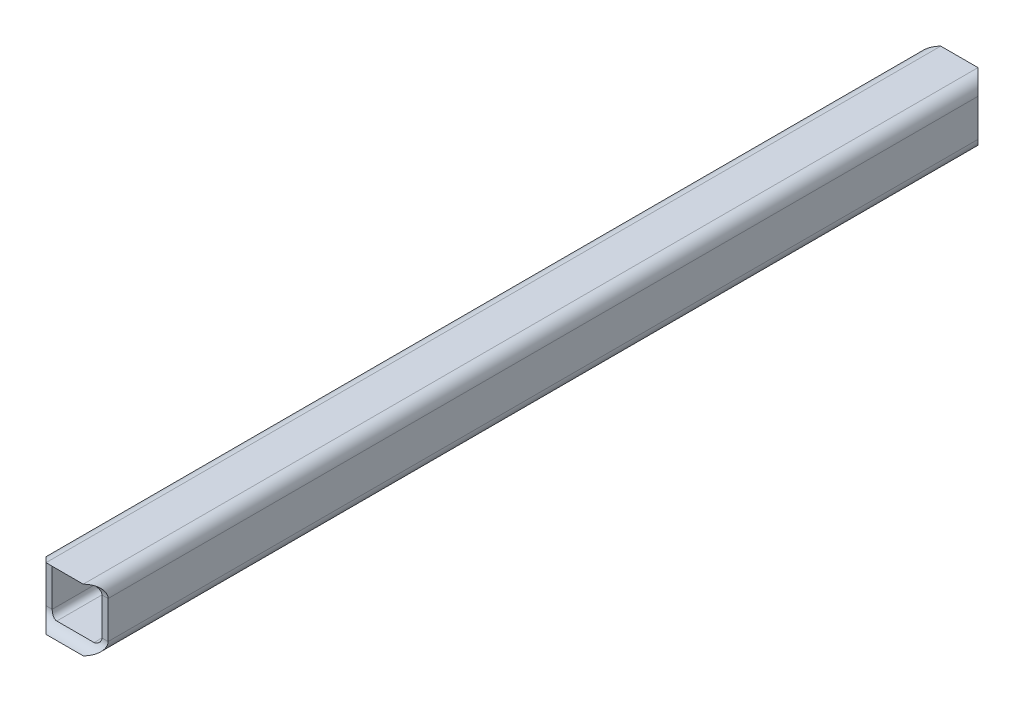
ISO-10303-21;
HEADER;
FILE_DESCRIPTION(('STEP AP214'),'2;1');
FILE_NAME('part.step','',(''),(''),'','','');
FILE_SCHEMA(('AUTOMOTIVE_DESIGN { 1 0 10303 214 1 1 1 1 }'));
ENDSEC;
DATA;
#1=APPLICATION_CONTEXT('core data for automotive mechanical design processes');
#2=APPLICATION_PROTOCOL_DEFINITION('international standard','automotive_design',2000,#1);
#3=PRODUCT_CONTEXT('',#1,'mechanical');
#4=PRODUCT('Part','Part','',(#3));
#5=PRODUCT_RELATED_PRODUCT_CATEGORY('part','',(#4));
#6=PRODUCT_DEFINITION_FORMATION('','',#4);
#7=PRODUCT_DEFINITION_CONTEXT('part definition',#1,'design');
#8=PRODUCT_DEFINITION('design','',#6,#7);
#9=PRODUCT_DEFINITION_SHAPE('','',#8);
#10=(LENGTH_UNIT() NAMED_UNIT(*) SI_UNIT(.MILLI.,.METRE.));
#11=(NAMED_UNIT(*) PLANE_ANGLE_UNIT() SI_UNIT($,.RADIAN.));
#12=(NAMED_UNIT(*) SI_UNIT($,.STERADIAN.) SOLID_ANGLE_UNIT());
#13=UNCERTAINTY_MEASURE_WITH_UNIT(LENGTH_MEASURE(1.E-05),#10,'distance_accuracy_value','');
#14=(GEOMETRIC_REPRESENTATION_CONTEXT(3) GLOBAL_UNCERTAINTY_ASSIGNED_CONTEXT((#13)) GLOBAL_UNIT_ASSIGNED_CONTEXT((#10,
#11,#12)) REPRESENTATION_CONTEXT('',''));
#15=CARTESIAN_POINT('',(0.,0.,0.));
#16=DIRECTION('',(0.,0.,1.));
#17=DIRECTION('',(1.,0.,0.));
#18=AXIS2_PLACEMENT_3D('',#15,#16,#17);
#19=CARTESIAN_POINT('',(-6.00000000000001,226.,-2300.));
#20=DIRECTION('',(0.,0.,1.));
#21=DIRECTION('',(0.,-1.,0.));
#22=AXIS2_PLACEMENT_3D('',#19,#20,#21);
#23=CYLINDRICAL_SURFACE('',#22,2.);
#24=DIRECTION('',(0.,0.,1.));
#25=VECTOR('',#24,1.);
#26=CARTESIAN_POINT('',(-8.00000000000001,226.,-2300.));
#27=LINE('',#26,#25);
#28=CARTESIAN_POINT('',(-8.00000000000001,226.,-2290.));
#29=VERTEX_POINT('',#28);
#30=CARTESIAN_POINT('',(-8.00000000000001,226.,-2010.));
#31=VERTEX_POINT('',#30);
#32=EDGE_CURVE('E180',#29,#31,#27,.T.);
#33=ORIENTED_EDGE('',*,*,#32,.F.);
#34=CARTESIAN_POINT('',(-8.00000000000001,226.,-2290.));
#35=CARTESIAN_POINT('',(-8.00000848506602,226.052797340358,-2289.99999062762));
#36=CARTESIAN_POINT('',(-7.9979095702602,226.105588673787,-2290.00104508588));
#37=CARTESIAN_POINT('',(-7.98956283651236,226.210739973092,-2290.00521134784));
#38=CARTESIAN_POINT('',(-7.98331668420857,226.263100103699,-2290.00832232508));
#39=CARTESIAN_POINT('',(-7.96677918947501,226.366774997858,-2290.01651263567));
#40=CARTESIAN_POINT('',(-7.95650648410159,226.418093447974,-2290.02158289887));
#41=CARTESIAN_POINT('',(-7.93204223131379,226.51955728034,-2290.03355642819));
#42=CARTESIAN_POINT('',(-7.91785044137546,226.569702589784,-2290.04045980775));
#43=CARTESIAN_POINT('',(-7.86964369116303,226.717754874098,-2290.06366150569));
#44=CARTESIAN_POINT('',(-7.8299624120358,226.813493220417,-2290.08246939668));
#45=CARTESIAN_POINT('',(-7.73691343059042,226.996864972804,-2290.12505966726));
#46=CARTESIAN_POINT('',(-7.68353190765241,227.084490072157,-2290.14884706562));
#47=CARTESIAN_POINT('',(-7.56096814283081,227.255009028206,-2290.200873856));
#48=CARTESIAN_POINT('',(-7.49103103000849,227.337305178749,-2290.22929456303));
#49=CARTESIAN_POINT('',(-7.33896043757015,227.489556741236,-2290.28679925712));
#50=CARTESIAN_POINT('',(-7.2568171652968,227.55950214501,-2290.31588376072));
#51=CARTESIAN_POINT('',(-7.07496660763722,227.690552489055,-2290.37404277688));
#52=CARTESIAN_POINT('',(-6.9743876641839,227.750536363107,-2290.40293818626));
#53=CARTESIAN_POINT('',(-6.76309931354659,227.852398436757,-2290.45431299306));
#54=CARTESIAN_POINT('',(-6.65241223109046,227.894315420264,-2290.47680609858));
#55=CARTESIAN_POINT('',(-6.45145248032495,227.950460347797,-2290.50765570179));
#56=CARTESIAN_POINT('',(-6.36268650425017,227.968926258292,-2290.51811247463));
#57=CARTESIAN_POINT('',(-6.22776613186867,227.987510890925,-2290.52871099753));
#58=CARTESIAN_POINT('',(-6.18240073628848,227.992186897653,-2290.5313963177));
#59=CARTESIAN_POINT('',(-6.09136258399695,227.998433811861,-2290.53499377436));
#60=CARTESIAN_POINT('',(-6.04568967449565,228.000003040701,-2290.53590495225));
#61=CARTESIAN_POINT('',(-6.00000000000008,228.,-2290.53589838486));
#62=B_SPLINE_CURVE_WITH_KNOTS('',3,(#34,#35,#36,#37,#38,#39,#40,#41,#42,#43,#44,#45,#46,#47,#48,
#49,#50,#51,#52,#53,#54,#55,#56,#57,#58,#59,#60,#61),.UNSPECIFIED.,.F.,.F.,(4,2,2,2,2,2,2,2,2,2,
2,2,2,4),(0.,0.158329806863478,0.316596024669341,0.474138190900043,0.631690108467023,
0.946146500350668,1.26092136705967,1.59454928426037,1.92844632145539,2.28848800862803,
2.6477529032409,2.92045951053451,3.05738651447662,3.19438748205582),.UNSPECIFIED.);
#63=CARTESIAN_POINT('',(-6.00000000000001,228.,-2290.53589838486));
#64=VERTEX_POINT('',#63);
#65=EDGE_CURVE('E206',#29,#64,#62,.T.);
#66=ORIENTED_EDGE('',*,*,#65,.T.);
#67=DIRECTION('',(0.,0.,1.));
#68=VECTOR('',#67,1.);
#69=CARTESIAN_POINT('',(-6.00000000000001,228.,-2300.));
#70=LINE('',#69,#68);
#71=CARTESIAN_POINT('',(-6.00000000000001,228.,-2009.46410161514));
#72=VERTEX_POINT('',#71);
#73=EDGE_CURVE('E203',#64,#72,#70,.T.);
#74=ORIENTED_EDGE('',*,*,#73,.T.);
#75=CARTESIAN_POINT('',(-6.00000000000001,228.,-2009.46410161514));
#76=CARTESIAN_POINT('',(-6.05238014858579,228.000009440751,-2009.4640862069));
#77=CARTESIAN_POINT('',(-6.10475173750401,227.99794256601,-2009.46528926947));
#78=CARTESIAN_POINT('',(-6.20903746023223,227.989730483867,-2009.4700163204));
#79=CARTESIAN_POINT('',(-6.2609518553272,227.983587782911,-2009.47353888235));
#80=CARTESIAN_POINT('',(-6.36364876204847,227.967345541887,-2009.48276228462));
#81=CARTESIAN_POINT('',(-6.41443610009714,227.957269218283,-2009.48845033927));
#82=CARTESIAN_POINT('',(-6.51482628147641,227.933292621216,-2009.50179490522));
#83=CARTESIAN_POINT('',(-6.56442898812649,227.919391908797,-2009.50945164246));
#84=CARTESIAN_POINT('',(-6.71076917247361,227.872238174737,-2009.53496935659));
#85=CARTESIAN_POINT('',(-6.80534715410664,227.83348371579,-2009.55540800132));
#86=CARTESIAN_POINT('',(-6.98672989575564,227.742611914619,-2009.6008158638));
#87=CARTESIAN_POINT('',(-7.07352198797482,227.690473309809,-2009.6257922718));
#88=CARTESIAN_POINT('',(-7.24461525249193,227.56932824363,-2009.67993971873));
#89=CARTESIAN_POINT('',(-7.32813282894913,227.499291317474,-2009.70928674935));
#90=CARTESIAN_POINT('',(-7.48283156094605,227.346491387324,-2009.76744521029));
#91=CARTESIAN_POINT('',(-7.55400890931997,227.263724470725,-2009.79625647288));
#92=CARTESIAN_POINT('',(-7.68676537546057,227.080936679866,-2009.85244289332));
#93=CARTESIAN_POINT('',(-7.74736267433231,226.980125245993,-2009.87958716856));
#94=CARTESIAN_POINT('',(-7.85032202135317,226.768206797584,-2009.9270340723));
#95=CARTESIAN_POINT('',(-7.89271226962707,226.657116031052,-2009.94734727049));
#96=CARTESIAN_POINT('',(-7.94968116248619,226.454997803613,-2009.97502213875));
#97=CARTESIAN_POINT('',(-7.96845962320424,226.36541132045,-2009.98430781774));
#98=CARTESIAN_POINT('',(-7.98733474672549,226.229367292104,-2009.99367902764));
#99=CARTESIAN_POINT('',(-7.99207779704409,226.183671261213,-2009.99604332168));
#100=CARTESIAN_POINT('',(-7.99841234175514,226.091988771696,-2009.99920598971));
#101=CARTESIAN_POINT('',(-8.00000253913828,226.046002201349,-2010.00000371925));
#102=CARTESIAN_POINT('',(-8.00000000000001,226.,-2010.));
#103=B_SPLINE_CURVE_WITH_KNOTS('',3,(#75,#76,#77,#78,#79,#80,#81,#82,#83,#84,#85,#86,#87,#88,
#89,#90,#91,#92,#93,#94,#95,#96,#97,#98,#99,#100,#101,#102),.UNSPECIFIED.,.F.,.F.,(4,2,2,2,2,2,
2,2,2,2,2,2,2,4),(0.,0.157071840937242,0.314047179273268,0.470109716412921,0.626190173600535,
0.937421271464493,1.2491498967558,1.58636095727888,1.92367586860981,2.28392845907447,
2.64362103970003,2.91855292168827,3.05643812246947,3.1943800342091),.UNSPECIFIED.);
#104=EDGE_CURVE('E205',#72,#31,#103,.T.);
#105=ORIENTED_EDGE('',*,*,#104,.T.);
#106=EDGE_LOOP('',(#33,#66,#74,#105));
#107=FACE_BOUND('',#106,.T.);
#108=ADVANCED_FACE('F41',(#107),#23,.F.);
#109=CARTESIAN_POINT('',(-6.00000000000001,228.,-2300.));
#110=DIRECTION('',(0.,-1.,0.));
#111=DIRECTION('',(1.,0.,0.));
#112=AXIS2_PLACEMENT_3D('',#109,#110,#111);
#113=PLANE('',#112);
#114=ORIENTED_EDGE('',*,*,#73,.F.);
#115=DIRECTION('',(-1.,0.,0.));
#116=VECTOR('',#115,1.);
#117=CARTESIAN_POINT('',(250.,228.,-2290.53589838486));
#118=LINE('',#117,#116);
#119=CARTESIAN_POINT('',(6.00000000000001,228.,-2290.53589838486));
#120=VERTEX_POINT('',#119);
#121=EDGE_CURVE('E210',#64,#120,#118,.F.);
#122=ORIENTED_EDGE('',*,*,#121,.T.);
#123=DIRECTION('',(0.,0.,1.));
#124=VECTOR('',#123,1.);
#125=CARTESIAN_POINT('',(6.00000000000001,228.,-2300.));
#126=LINE('',#125,#124);
#127=CARTESIAN_POINT('',(6.00000000000001,228.,-2009.46410161514));
#128=VERTEX_POINT('',#127);
#129=EDGE_CURVE('E207',#120,#128,#126,.T.);
#130=ORIENTED_EDGE('',*,*,#129,.T.);
#131=DIRECTION('',(1.,0.,0.));
#132=VECTOR('',#131,1.);
#133=CARTESIAN_POINT('',(-250.,228.,-2009.46410161514));
#134=LINE('',#133,#132);
#135=EDGE_CURVE('E209',#128,#72,#134,.F.);
#136=ORIENTED_EDGE('',*,*,#135,.T.);
#137=EDGE_LOOP('',(#114,#122,#130,#136));
#138=FACE_BOUND('',#137,.T.);
#139=ADVANCED_FACE('F331',(#138),#113,.T.);
#140=CARTESIAN_POINT('',(6.00000000000001,226.,-2300.));
#141=DIRECTION('',(0.,0.,1.));
#142=DIRECTION('',(0.,-1.,0.));
#143=AXIS2_PLACEMENT_3D('',#140,#141,#142);
#144=CYLINDRICAL_SURFACE('',#143,2.);
#145=ORIENTED_EDGE('',*,*,#129,.F.);
#146=CARTESIAN_POINT('',(6.00000000000001,228.,-2290.53589838486));
#147=CARTESIAN_POINT('',(6.05238014858579,228.000009440751,-2290.5359137931));
#148=CARTESIAN_POINT('',(6.10475173750401,227.99794256601,-2290.53471073053));
#149=CARTESIAN_POINT('',(6.20903746023225,227.989730483867,-2290.5299836796));
#150=CARTESIAN_POINT('',(6.26095185532723,227.983587782911,-2290.52646111765));
#151=CARTESIAN_POINT('',(6.36364876204851,227.967345541887,-2290.51723771538));
#152=CARTESIAN_POINT('',(6.41443610009718,227.957269218283,-2290.51154966073));
#153=CARTESIAN_POINT('',(6.51482628147642,227.933292621216,-2290.49820509479));
#154=CARTESIAN_POINT('',(6.5644289881265,227.919391908797,-2290.49054835754));
#155=CARTESIAN_POINT('',(6.71076917247359,227.872238174737,-2290.46503064341));
#156=CARTESIAN_POINT('',(6.8053471541066,227.83348371579,-2290.44459199868));
#157=CARTESIAN_POINT('',(6.98672989575559,227.742611914619,-2290.3991841362));
#158=CARTESIAN_POINT('',(7.07352198797479,227.690473309809,-2290.3742077282));
#159=CARTESIAN_POINT('',(7.24461525249188,227.56932824363,-2290.32006028127));
#160=CARTESIAN_POINT('',(7.32813282894907,227.499291317474,-2290.29071325065));
#161=CARTESIAN_POINT('',(7.48283156094598,227.346491387324,-2290.23255478971));
#162=CARTESIAN_POINT('',(7.5540089093199,227.263724470725,-2290.20374352712));
#163=CARTESIAN_POINT('',(7.68676537546051,227.080936679866,-2290.14755710668));
#164=CARTESIAN_POINT('',(7.74736267433226,226.980125245993,-2290.12041283144));
#165=CARTESIAN_POINT('',(7.85032202135316,226.768206797584,-2290.0729659277));
#166=CARTESIAN_POINT('',(7.89271226962708,226.657116031052,-2290.05265272951));
#167=CARTESIAN_POINT('',(7.94968116248622,226.454997803613,-2290.02497786125));
#168=CARTESIAN_POINT('',(7.96845962320427,226.36541132045,-2290.01569218226));
#169=CARTESIAN_POINT('',(7.9873347467255,226.229367292104,-2290.00632097236));
#170=CARTESIAN_POINT('',(7.9920777970441,226.183671261213,-2290.00395667832));
#171=CARTESIAN_POINT('',(7.99841234175514,226.091988771696,-2290.00079401029));
#172=CARTESIAN_POINT('',(8.00000253913828,226.046002201349,-2289.99999628075));
#173=CARTESIAN_POINT('',(8.00000000000001,226.,-2290.));
#174=B_SPLINE_CURVE_WITH_KNOTS('',3,(#146,#147,#148,#149,#150,#151,#152,#153,#154,#155,#156,
#157,#158,#159,#160,#161,#162,#163,#164,#165,#166,#167,#168,#169,#170,#171,#172,#173),
.UNSPECIFIED.,.F.,.F.,(4,2,2,2,2,2,2,2,2,2,2,2,2,4),(0.,0.157071840937248,0.314047179273321,
0.470109716412942,0.626190173600534,0.937421271464422,1.2491498967558,1.58636095727864,
1.92367586860957,2.28392845907436,2.64362103970012,2.91855292168837,3.05643812246954,
3.19438003420911),.UNSPECIFIED.);
#175=CARTESIAN_POINT('',(8.00000000000001,226.,-2290.));
#176=VERTEX_POINT('',#175);
#177=EDGE_CURVE('E214',#120,#176,#174,.T.);
#178=ORIENTED_EDGE('',*,*,#177,.T.);
#179=DIRECTION('',(0.,0.,1.));
#180=VECTOR('',#179,1.);
#181=CARTESIAN_POINT('',(8.00000000000001,226.,-2300.));
#182=LINE('',#181,#180);
#183=CARTESIAN_POINT('',(8.00000000000001,226.,-2010.));
#184=VERTEX_POINT('',#183);
#185=EDGE_CURVE('E211',#176,#184,#182,.T.);
#186=ORIENTED_EDGE('',*,*,#185,.T.);
#187=CARTESIAN_POINT('',(8.00000000000001,226.,-2010.));
#188=CARTESIAN_POINT('',(8.00000848506603,226.052797340358,-2010.00000937238));
#189=CARTESIAN_POINT('',(7.9979095702602,226.105588673787,-2009.99895491412));
#190=CARTESIAN_POINT('',(7.98956283651236,226.210739973092,-2009.99478865216));
#191=CARTESIAN_POINT('',(7.98331668420857,226.263100103699,-2009.99167767492));
#192=CARTESIAN_POINT('',(7.96677918947502,226.366774997858,-2009.98348736433));
#193=CARTESIAN_POINT('',(7.95650648410161,226.418093447974,-2009.97841710113));
#194=CARTESIAN_POINT('',(7.9320422313138,226.51955728034,-2009.96644357181));
#195=CARTESIAN_POINT('',(7.91785044137547,226.569702589784,-2009.95954019225));
#196=CARTESIAN_POINT('',(7.86964369116302,226.717754874098,-2009.93633849431));
#197=CARTESIAN_POINT('',(7.82996241203578,226.813493220417,-2009.91753060332));
#198=CARTESIAN_POINT('',(7.73691343059039,226.996864972804,-2009.87494033274));
#199=CARTESIAN_POINT('',(7.68353190765239,227.084490072157,-2009.85115293439));
#200=CARTESIAN_POINT('',(7.56096814283083,227.255009028206,-2009.799126144));
#201=CARTESIAN_POINT('',(7.49103103000855,227.337305178749,-2009.77070543697));
#202=CARTESIAN_POINT('',(7.33896043757022,227.489556741236,-2009.71320074288));
#203=CARTESIAN_POINT('',(7.25681716529683,227.55950214501,-2009.68411623928));
#204=CARTESIAN_POINT('',(7.07496660763723,227.690552489055,-2009.62595722312));
#205=CARTESIAN_POINT('',(6.97438766418392,227.750536363107,-2009.59706181374));
#206=CARTESIAN_POINT('',(6.76309931354665,227.852398436757,-2009.54568700694));
#207=CARTESIAN_POINT('',(6.65241223109055,227.894315420264,-2009.52319390142));
#208=CARTESIAN_POINT('',(6.45145248032505,227.950460347797,-2009.49234429821));
#209=CARTESIAN_POINT('',(6.36268650425027,227.968926258292,-2009.48188752537));
#210=CARTESIAN_POINT('',(6.22776613186874,227.987510890925,-2009.47128900247));
#211=CARTESIAN_POINT('',(6.18240073628854,227.992186897653,-2009.4686036823));
#212=CARTESIAN_POINT('',(6.09136258399698,227.998433811861,-2009.46500622564));
#213=CARTESIAN_POINT('',(6.04568967449566,228.000003040701,-2009.46409504775));
#214=CARTESIAN_POINT('',(6.00000000000008,228.,-2009.46410161514));
#215=B_SPLINE_CURVE_WITH_KNOTS('',3,(#187,#188,#189,#190,#191,#192,#193,#194,#195,#196,#197,
#198,#199,#200,#201,#202,#203,#204,#205,#206,#207,#208,#209,#210,#211,#212,#213,#214),
.UNSPECIFIED.,.F.,.F.,(4,2,2,2,2,2,2,2,2,2,2,2,2,4),(0.,0.158329806863478,0.316596024669313,
0.474138190899985,0.631690108467023,0.946146500350759,1.26092136705967,1.59454928426026,
1.9284463214554,2.288488008628,2.64775290324079,2.92045951053443,3.05738651447658,
3.19438748205583),.UNSPECIFIED.);
#216=EDGE_CURVE('E213',#184,#128,#215,.T.);
#217=ORIENTED_EDGE('',*,*,#216,.T.);
#218=EDGE_LOOP('',(#145,#178,#186,#217));
#219=FACE_BOUND('',#218,.T.);
#220=ADVANCED_FACE('F328',(#219),#144,.F.);
#221=CARTESIAN_POINT('',(6.00000000000001,214.,-2300.));
#222=DIRECTION('',(0.,0.,1.));
#223=DIRECTION('',(0.,-1.,0.));
#224=AXIS2_PLACEMENT_3D('',#221,#222,#223);
#225=CYLINDRICAL_SURFACE('',#224,2.);
#226=DIRECTION('',(0.,0.,1.));
#227=VECTOR('',#226,1.);
#228=CARTESIAN_POINT('',(8.00000000000001,214.,-2300.));
#229=LINE('',#228,#227);
#230=CARTESIAN_POINT('',(8.00000000000001,214.,-2290.));
#231=VERTEX_POINT('',#230);
#232=CARTESIAN_POINT('',(8.00000000000001,214.,-2010.));
#233=VERTEX_POINT('',#232);
#234=EDGE_CURVE('E215',#231,#233,#229,.T.);
#235=ORIENTED_EDGE('',*,*,#234,.F.);
#236=CARTESIAN_POINT('',(8.00000000000001,214.,-2290.));
#237=CARTESIAN_POINT('',(8.00000848506603,213.947202659642,-2289.99999062762));
#238=CARTESIAN_POINT('',(7.9979095702602,213.894411326213,-2290.00104508588));
#239=CARTESIAN_POINT('',(7.98956283651236,213.789260026908,-2290.00521134784));
#240=CARTESIAN_POINT('',(7.98331668420856,213.736899896301,-2290.00832232508));
#241=CARTESIAN_POINT('',(7.96677918947501,213.633225002143,-2290.01651263567));
#242=CARTESIAN_POINT('',(7.9565064841016,213.581906552027,-2290.02158289887));
#243=CARTESIAN_POINT('',(7.9320422313138,213.480442719661,-2290.03355642819));
#244=CARTESIAN_POINT('',(7.91785044137546,213.430297410216,-2290.04045980775));
#245=CARTESIAN_POINT('',(7.86964369116303,213.282245125902,-2290.06366150569));
#246=CARTESIAN_POINT('',(7.82996241203583,213.186506779583,-2290.08246939668));
#247=CARTESIAN_POINT('',(7.73691343059047,213.003135027197,-2290.12505966726));
#248=CARTESIAN_POINT('',(7.68353190765247,212.915509927843,-2290.14884706562));
#249=CARTESIAN_POINT('',(7.56096814283087,212.744990971794,-2290.200873856));
#250=CARTESIAN_POINT('',(7.49103103000854,212.662694821251,-2290.22929456303));
#251=CARTESIAN_POINT('',(7.33896043757019,212.510443258764,-2290.28679925712));
#252=CARTESIAN_POINT('',(7.25681716529681,212.44049785499,-2290.31588376072));
#253=CARTESIAN_POINT('',(7.07496660763725,212.309447510945,-2290.37404277688));
#254=CARTESIAN_POINT('',(6.97438766418398,212.249463636893,-2290.40293818626));
#255=CARTESIAN_POINT('',(6.76309931354675,212.147601563244,-2290.45431299306));
#256=CARTESIAN_POINT('',(6.65241223109066,212.105684579736,-2290.47680609858));
#257=CARTESIAN_POINT('',(6.45145248032512,212.049539652203,-2290.50765570179));
#258=CARTESIAN_POINT('',(6.3626865042503,212.031073741708,-2290.51811247463));
#259=CARTESIAN_POINT('',(6.22776613186872,212.012489109075,-2290.52871099753));
#260=CARTESIAN_POINT('',(6.18240073628851,212.007813102347,-2290.5313963177));
#261=CARTESIAN_POINT('',(6.09136258399694,212.001566188139,-2290.53499377436));
#262=CARTESIAN_POINT('',(6.04568967449562,211.999996959299,-2290.53590495225));
#263=CARTESIAN_POINT('',(6.00000000000004,212.,-2290.53589838486));
#264=B_SPLINE_CURVE_WITH_KNOTS('',3,(#236,#237,#238,#239,#240,#241,#242,#243,#244,#245,#246,
#247,#248,#249,#250,#251,#252,#253,#254,#255,#256,#257,#258,#259,#260,#261,#262,#263),
.UNSPECIFIED.,.F.,.F.,(4,2,2,2,2,2,2,2,2,2,2,2,2,4),(0.,0.158329806863505,0.316596024669397,
0.474138190900014,0.631690108466965,0.946146500350626,1.26092136705959,1.59454928426019,
1.92844632145534,2.28848800862777,2.64775290324069,2.92045951053443,3.05738651447661,
3.19438748205586),.UNSPECIFIED.);
#265=CARTESIAN_POINT('',(6.00000000000001,212.,-2290.53589838486));
#266=VERTEX_POINT('',#265);
#267=EDGE_CURVE('E90',#231,#266,#264,.T.);
#268=ORIENTED_EDGE('',*,*,#267,.T.);
#269=DIRECTION('',(0.,0.,1.));
#270=VECTOR('',#269,1.);
#271=CARTESIAN_POINT('',(6.00000000000001,212.,-2300.));
#272=LINE('',#271,#270);
#273=CARTESIAN_POINT('',(6.00000000000001,212.,-2009.46410161514));
#274=VERTEX_POINT('',#273);
#275=EDGE_CURVE('E218',#266,#274,#272,.T.);
#276=ORIENTED_EDGE('',*,*,#275,.T.);
#277=CARTESIAN_POINT('',(6.00000000000001,212.,-2009.46410161514));
#278=CARTESIAN_POINT('',(6.05238014858579,211.99999055925,-2009.4640862069));
#279=CARTESIAN_POINT('',(6.10475173750398,212.00205743399,-2009.46528926947));
#280=CARTESIAN_POINT('',(6.20903746023218,212.010269516134,-2009.4700163204));
#281=CARTESIAN_POINT('',(6.26095185532714,212.01641221709,-2009.47353888236));
#282=CARTESIAN_POINT('',(6.36364876204845,212.032654458113,-2009.48276228462));
#283=CARTESIAN_POINT('',(6.41443610009716,212.042730781717,-2009.48845033927));
#284=CARTESIAN_POINT('',(6.51482628147644,212.066707378784,-2009.50179490522));
#285=CARTESIAN_POINT('',(6.56442898812651,212.080608091203,-2009.50945164246));
#286=CARTESIAN_POINT('',(6.7107691724736,212.127761825263,-2009.53496935659));
#287=CARTESIAN_POINT('',(6.80534715410662,212.16651628421,-2009.55540800132));
#288=CARTESIAN_POINT('',(6.98672989575563,212.257388085381,-2009.6008158638));
#289=CARTESIAN_POINT('',(7.07352198797483,212.309526690191,-2009.6257922718));
#290=CARTESIAN_POINT('',(7.24461525249193,212.43067175637,-2009.67993971873));
#291=CARTESIAN_POINT('',(7.32813282894911,212.500708682526,-2009.70928674935));
#292=CARTESIAN_POINT('',(7.48283156094601,212.653508612676,-2009.76744521029));
#293=CARTESIAN_POINT('',(7.55400890931993,212.736275529276,-2009.79625647288));
#294=CARTESIAN_POINT('',(7.68676537546054,212.919063320134,-2009.85244289332));
#295=CARTESIAN_POINT('',(7.7473626743323,213.019874754007,-2009.87958716856));
#296=CARTESIAN_POINT('',(7.85032202135319,213.231793202417,-2009.9270340723));
#297=CARTESIAN_POINT('',(7.89271226962709,213.342883968948,-2009.94734727049));
#298=CARTESIAN_POINT('',(7.94968116248621,213.545002196388,-2009.97502213875));
#299=CARTESIAN_POINT('',(7.96845962320425,213.63458867955,-2009.98430781774));
#300=CARTESIAN_POINT('',(7.98733474672549,213.770632707896,-2009.99367902764));
#301=CARTESIAN_POINT('',(7.99207779704409,213.816328738787,-2009.99604332168));
#302=CARTESIAN_POINT('',(7.99841234175513,213.908011228304,-2009.99920598971));
#303=CARTESIAN_POINT('',(8.00000253913828,213.953997798651,-2010.00000371925));
#304=CARTESIAN_POINT('',(8.00000000000001,214.,-2010.));
#305=B_SPLINE_CURVE_WITH_KNOTS('',3,(#277,#278,#279,#280,#281,#282,#283,#284,#285,#286,#287,
#288,#289,#290,#291,#292,#293,#294,#295,#296,#297,#298,#299,#300,#301,#302,#303,#304),
.UNSPECIFIED.,.F.,.F.,(4,2,2,2,2,2,2,2,2,2,2,2,2,4),(0.,0.157071840937187,0.314047179273269,
0.470109716412927,0.626190173600531,0.937421271464433,1.2491498967558,1.58636095727882,
1.92367586860976,2.28392845907443,2.64362103970015,2.91855292168828,3.0564381224694,
3.19438003420895),.UNSPECIFIED.);
#306=EDGE_CURVE('E220',#274,#233,#305,.T.);
#307=ORIENTED_EDGE('',*,*,#306,.T.);
#308=EDGE_LOOP('',(#235,#268,#276,#307));
#309=FACE_BOUND('',#308,.T.);
#310=ADVANCED_FACE('F270',(#309),#225,.F.);
#311=CARTESIAN_POINT('',(6.00000000000001,212.,-2300.));
#312=DIRECTION('',(0.,1.,0.));
#313=DIRECTION('',(-1.,0.,0.));
#314=AXIS2_PLACEMENT_3D('',#311,#312,#313);
#315=PLANE('',#314);
#316=ORIENTED_EDGE('',*,*,#275,.F.);
#317=DIRECTION('',(-1.,0.,0.));
#318=VECTOR('',#317,1.);
#319=CARTESIAN_POINT('',(250.,212.,-2290.53589838486));
#320=LINE('',#319,#318);
#321=CARTESIAN_POINT('',(-5.99999999999999,212.,-2290.53589838486));
#322=VERTEX_POINT('',#321);
#323=EDGE_CURVE('E222',#266,#322,#320,.T.);
#324=ORIENTED_EDGE('',*,*,#323,.T.);
#325=DIRECTION('',(0.,0.,1.));
#326=VECTOR('',#325,1.);
#327=CARTESIAN_POINT('',(-6.00000000000001,212.,-2300.));
#328=LINE('',#327,#326);
#329=CARTESIAN_POINT('',(-6.00000000000001,212.,-2009.46410161514));
#330=VERTEX_POINT('',#329);
#331=EDGE_CURVE('E189',#322,#330,#328,.T.);
#332=ORIENTED_EDGE('',*,*,#331,.T.);
#333=DIRECTION('',(1.,0.,0.));
#334=VECTOR('',#333,1.);
#335=CARTESIAN_POINT('',(-250.,212.,-2009.46410161514));
#336=LINE('',#335,#334);
#337=EDGE_CURVE('E190',#330,#274,#336,.T.);
#338=ORIENTED_EDGE('',*,*,#337,.T.);
#339=EDGE_LOOP('',(#316,#324,#332,#338));
#340=FACE_BOUND('',#339,.T.);
#341=ADVANCED_FACE('F423',(#340),#315,.T.);
#342=CARTESIAN_POINT('',(-6.00000000000001,214.,-2300.));
#343=DIRECTION('',(0.,0.,1.));
#344=DIRECTION('',(0.,-1.,0.));
#345=AXIS2_PLACEMENT_3D('',#342,#343,#344);
#346=CYLINDRICAL_SURFACE('',#345,2.);
#347=ORIENTED_EDGE('',*,*,#331,.F.);
#348=CARTESIAN_POINT('',(-5.99999999999999,212.,-2290.53589838486));
#349=CARTESIAN_POINT('',(-6.05238014858577,211.99999055925,-2290.5359137931));
#350=CARTESIAN_POINT('',(-6.10475173750398,212.00205743399,-2290.53471073053));
#351=CARTESIAN_POINT('',(-6.20903746023221,212.010269516134,-2290.5299836796));
#352=CARTESIAN_POINT('',(-6.26095185532718,212.01641221709,-2290.52646111764));
#353=CARTESIAN_POINT('',(-6.36364876204845,212.032654458113,-2290.51723771538));
#354=CARTESIAN_POINT('',(-6.41443610009713,212.042730781717,-2290.51154966073));
#355=CARTESIAN_POINT('',(-6.51482628147639,212.066707378784,-2290.49820509479));
#356=CARTESIAN_POINT('',(-6.56442898812649,212.080608091203,-2290.49054835754));
#357=CARTESIAN_POINT('',(-6.71076917247356,212.127761825263,-2290.46503064341));
#358=CARTESIAN_POINT('',(-6.80534715410655,212.16651628421,-2290.44459199868));
#359=CARTESIAN_POINT('',(-6.98672989575556,212.257388085381,-2290.3991841362));
#360=CARTESIAN_POINT('',(-7.07352198797479,212.309526690191,-2290.3742077282));
#361=CARTESIAN_POINT('',(-7.24461525249191,212.43067175637,-2290.32006028127));
#362=CARTESIAN_POINT('',(-7.3281328289491,212.500708682526,-2290.29071325065));
#363=CARTESIAN_POINT('',(-7.482831560946,212.653508612676,-2290.23255478971));
#364=CARTESIAN_POINT('',(-7.55400890931993,212.736275529276,-2290.20374352712));
#365=CARTESIAN_POINT('',(-7.68676537546053,212.919063320134,-2290.14755710668));
#366=CARTESIAN_POINT('',(-7.74736267433227,213.019874754007,-2290.12041283144));
#367=CARTESIAN_POINT('',(-7.85032202135317,213.231793202417,-2290.0729659277));
#368=CARTESIAN_POINT('',(-7.89271226962708,213.342883968948,-2290.05265272951));
#369=CARTESIAN_POINT('',(-7.9496811624862,213.545002196388,-2290.02497786125));
#370=CARTESIAN_POINT('',(-7.96845962320425,213.63458867955,-2290.01569218226));
#371=CARTESIAN_POINT('',(-7.98733474672549,213.770632707896,-2290.00632097236));
#372=CARTESIAN_POINT('',(-7.99207779704409,213.816328738787,-2290.00395667832));
#373=CARTESIAN_POINT('',(-7.99841234175513,213.908011228304,-2290.00079401029));
#374=CARTESIAN_POINT('',(-8.00000253913828,213.953997798651,-2289.99999628075));
#375=CARTESIAN_POINT('',(-8.00000000000001,214.,-2290.));
#376=B_SPLINE_CURVE_WITH_KNOTS('',3,(#348,#349,#350,#351,#352,#353,#354,#355,#356,#357,#358,
#359,#360,#361,#362,#363,#364,#365,#366,#367,#368,#369,#370,#371,#372,#373,#374,#375),
.UNSPECIFIED.,.F.,.F.,(4,2,2,2,2,2,2,2,2,2,2,2,2,4),(0.,0.157071840937242,0.314047179273292,
0.470109716412869,0.626190173600513,0.937421271464318,1.24914989675578,1.58636095727879,
1.92367586860973,2.28392845907433,2.64362103970012,2.91855292168828,3.0564381224694,
3.19438003420892),.UNSPECIFIED.);
#377=CARTESIAN_POINT('',(-8.00000000000001,214.,-2290.));
#378=VERTEX_POINT('',#377);
#379=EDGE_CURVE('E169',#322,#378,#376,.T.);
#380=ORIENTED_EDGE('',*,*,#379,.T.);
#381=DIRECTION('',(0.,0.,1.));
#382=VECTOR('',#381,1.);
#383=CARTESIAN_POINT('',(-8.00000000000001,214.,-2300.));
#384=LINE('',#383,#382);
#385=CARTESIAN_POINT('',(-8.00000000000001,214.,-2010.));
#386=VERTEX_POINT('',#385);
#387=EDGE_CURVE('E187',#378,#386,#384,.T.);
#388=ORIENTED_EDGE('',*,*,#387,.T.);
#389=CARTESIAN_POINT('',(-8.00000000000001,214.,-2010.));
#390=CARTESIAN_POINT('',(-8.00000848506603,213.947202659642,-2010.00000937238));
#391=CARTESIAN_POINT('',(-7.9979095702602,213.894411326213,-2009.99895491412));
#392=CARTESIAN_POINT('',(-7.98956283651236,213.789260026908,-2009.99478865216));
#393=CARTESIAN_POINT('',(-7.98331668420857,213.736899896301,-2009.99167767492));
#394=CARTESIAN_POINT('',(-7.96677918947502,213.633225002143,-2009.98348736433));
#395=CARTESIAN_POINT('',(-7.95650648410161,213.581906552027,-2009.97841710113));
#396=CARTESIAN_POINT('',(-7.9320422313138,213.480442719661,-2009.96644357181));
#397=CARTESIAN_POINT('',(-7.91785044137546,213.430297410216,-2009.95954019225));
#398=CARTESIAN_POINT('',(-7.86964369116301,213.282245125902,-2009.93633849431));
#399=CARTESIAN_POINT('',(-7.82996241203579,213.186506779583,-2009.91753060332));
#400=CARTESIAN_POINT('',(-7.73691343059042,213.003135027197,-2009.87494033274));
#401=CARTESIAN_POINT('',(-7.68353190765244,212.915509927843,-2009.85115293439));
#402=CARTESIAN_POINT('',(-7.56096814283087,212.744990971794,-2009.799126144));
#403=CARTESIAN_POINT('',(-7.49103103000853,212.662694821251,-2009.77070543697));
#404=CARTESIAN_POINT('',(-7.33896043757017,212.510443258764,-2009.71320074288));
#405=CARTESIAN_POINT('',(-7.2568171652968,212.44049785499,-2009.68411623928));
#406=CARTESIAN_POINT('',(-7.07496660763724,212.309447510945,-2009.62595722312));
#407=CARTESIAN_POINT('',(-6.97438766418397,212.249463636893,-2009.59706181374));
#408=CARTESIAN_POINT('',(-6.76309931354676,212.147601563244,-2009.54568700694));
#409=CARTESIAN_POINT('',(-6.65241223109066,212.105684579736,-2009.52319390142));
#410=CARTESIAN_POINT('',(-6.45145248032512,212.049539652203,-2009.49234429821));
#411=CARTESIAN_POINT('',(-6.3626865042503,212.031073741708,-2009.48188752537));
#412=CARTESIAN_POINT('',(-6.22776613186873,212.012489109075,-2009.47128900247));
#413=CARTESIAN_POINT('',(-6.18240073628851,212.007813102347,-2009.4686036823));
#414=CARTESIAN_POINT('',(-6.09136258399692,212.001566188139,-2009.46500622564));
#415=CARTESIAN_POINT('',(-6.04568967449559,211.999996959299,-2009.46409504775));
#416=CARTESIAN_POINT('',(-5.99999999999999,212.,-2009.46410161514));
#417=B_SPLINE_CURVE_WITH_KNOTS('',3,(#389,#390,#391,#392,#393,#394,#395,#396,#397,#398,#399,
#400,#401,#402,#403,#404,#405,#406,#407,#408,#409,#410,#411,#412,#413,#414,#415,#416),
.UNSPECIFIED.,.F.,.F.,(4,2,2,2,2,2,2,2,2,2,2,2,2,4),(0.,0.158329806863505,0.316596024669341,
0.474138190899986,0.631690108466965,0.946146500350752,1.26092136705959,1.59454928426023,
1.92844632145534,2.28848800862778,2.64775290324069,2.92045951053442,3.05738651447661,
3.19438748205591),.UNSPECIFIED.);
#418=EDGE_CURVE('E196',#386,#330,#417,.T.);
#419=ORIENTED_EDGE('',*,*,#418,.T.);
#420=EDGE_LOOP('',(#347,#380,#388,#419));
#421=FACE_BOUND('',#420,.T.);
#422=ADVANCED_FACE('F185',(#421),#346,.F.);
#423=CARTESIAN_POINT('',(6.00000000000001,226.,-2300.));
#424=DIRECTION('',(0.,0.,1.));
#425=DIRECTION('',(0.,-1.,0.));
#426=AXIS2_PLACEMENT_3D('',#423,#424,#425);
#427=CYLINDRICAL_SURFACE('',#426,4.);
#428=CARTESIAN_POINT('',(6.00000000000001,226.,-2294.));
#429=DIRECTION('',(-0.707106781186547,0.,0.707106781186547));
#430=DIRECTION('',(0.707106781186547,0.,0.707106781186547));
#431=AXIS2_PLACEMENT_3D('',#428,#429,#430);
#432=ELLIPSE('',#431,5.65685424949238,4.);
#433=CARTESIAN_POINT('',(6.00000000000001,230.,-2294.));
#434=VERTEX_POINT('',#433);
#435=CARTESIAN_POINT('',(10.,226.,-2290.));
#436=VERTEX_POINT('',#435);
#437=EDGE_CURVE('E344',#434,#436,#432,.F.);
#438=ORIENTED_EDGE('',*,*,#437,.F.);
#439=DIRECTION('',(0.,0.,1.));
#440=VECTOR('',#439,1.);
#441=CARTESIAN_POINT('',(6.00000000000001,230.,-2300.));
#442=LINE('',#441,#440);
#443=CARTESIAN_POINT('',(6.00000000000001,230.,-2006.));
#444=VERTEX_POINT('',#443);
#445=EDGE_CURVE('E45',#434,#444,#442,.T.);
#446=ORIENTED_EDGE('',*,*,#445,.T.);
#447=CARTESIAN_POINT('',(6.00000000000001,226.,-2006.));
#448=DIRECTION('',(0.707106781186547,0.,0.707106781186547));
#449=DIRECTION('',(-0.707106781186547,0.,0.707106781186547));
#450=AXIS2_PLACEMENT_3D('',#447,#448,#449);
#451=ELLIPSE('',#450,5.65685424949238,4.);
#452=CARTESIAN_POINT('',(10.,226.,-2010.));
#453=VERTEX_POINT('',#452);
#454=EDGE_CURVE('E257',#453,#444,#451,.T.);
#455=ORIENTED_EDGE('',*,*,#454,.F.);
#456=DIRECTION('',(0.,0.,1.));
#457=VECTOR('',#456,1.);
#458=CARTESIAN_POINT('',(10.,226.,-2300.));
#459=LINE('',#458,#457);
#460=EDGE_CURVE('E227',#436,#453,#459,.T.);
#461=ORIENTED_EDGE('',*,*,#460,.F.);
#462=EDGE_LOOP('',(#438,#446,#455,#461));
#463=FACE_BOUND('',#462,.T.);
#464=ADVANCED_FACE('F43',(#463),#427,.T.);
#465=CARTESIAN_POINT('',(-6.00000000000001,230.,-2300.));
#466=DIRECTION('',(0.,-1.,0.));
#467=DIRECTION('',(1.,0.,0.));
#468=AXIS2_PLACEMENT_3D('',#465,#466,#467);
#469=PLANE('',#468);
#470=DIRECTION('',(-1.,0.,0.));
#471=VECTOR('',#470,1.);
#472=CARTESIAN_POINT('',(250.,230.,-2294.));
#473=LINE('',#472,#471);
#474=CARTESIAN_POINT('',(-6.00000000000001,230.,-2294.));
#475=VERTEX_POINT('',#474);
#476=EDGE_CURVE('E371',#434,#475,#473,.T.);
#477=ORIENTED_EDGE('',*,*,#476,.T.);
#478=DIRECTION('',(0.,0.,1.));
#479=VECTOR('',#478,1.);
#480=CARTESIAN_POINT('',(-6.00000000000001,230.,-2300.));
#481=LINE('',#480,#479);
#482=CARTESIAN_POINT('',(-6.00000000000001,230.,-2006.));
#483=VERTEX_POINT('',#482);
#484=EDGE_CURVE('E261',#475,#483,#481,.T.);
#485=ORIENTED_EDGE('',*,*,#484,.T.);
#486=DIRECTION('',(1.,0.,0.));
#487=VECTOR('',#486,1.);
#488=CARTESIAN_POINT('',(-250.,230.,-2006.));
#489=LINE('',#488,#487);
#490=EDGE_CURVE('E232',#483,#444,#489,.T.);
#491=ORIENTED_EDGE('',*,*,#490,.T.);
#492=ORIENTED_EDGE('',*,*,#445,.F.);
#493=EDGE_LOOP('',(#477,#485,#491,#492));
#494=FACE_BOUND('',#493,.T.);
#495=ADVANCED_FACE('F377',(#494),#469,.F.);
#496=CARTESIAN_POINT('',(-6.00000000000001,226.,-2300.));
#497=DIRECTION('',(0.,0.,1.));
#498=DIRECTION('',(0.,-1.,0.));
#499=AXIS2_PLACEMENT_3D('',#496,#497,#498);
#500=CYLINDRICAL_SURFACE('',#499,4.);
#501=CARTESIAN_POINT('',(-6.00000000000001,226.,-2294.));
#502=DIRECTION('',(0.707106781186547,0.,0.707106781186547));
#503=DIRECTION('',(-0.707106781186547,0.,0.707106781186547));
#504=AXIS2_PLACEMENT_3D('',#501,#502,#503);
#505=ELLIPSE('',#504,5.65685424949238,4.);
#506=CARTESIAN_POINT('',(-10.,226.,-2290.));
#507=VERTEX_POINT('',#506);
#508=EDGE_CURVE('E347',#507,#475,#505,.F.);
#509=ORIENTED_EDGE('',*,*,#508,.F.);
#510=DIRECTION('',(0.,0.,1.));
#511=VECTOR('',#510,1.);
#512=CARTESIAN_POINT('',(-10.,226.,-2300.));
#513=LINE('',#512,#511);
#514=CARTESIAN_POINT('',(-10.,226.,-2010.));
#515=VERTEX_POINT('',#514);
#516=EDGE_CURVE('E230',#507,#515,#513,.T.);
#517=ORIENTED_EDGE('',*,*,#516,.T.);
#518=CARTESIAN_POINT('',(-6.00000000000001,226.,-2006.));
#519=DIRECTION('',(-0.707106781186547,0.,0.707106781186547));
#520=DIRECTION('',(0.707106781186547,0.,0.707106781186547));
#521=AXIS2_PLACEMENT_3D('',#518,#519,#520);
#522=ELLIPSE('',#521,5.65685424949238,4.);
#523=EDGE_CURVE('E385',#483,#515,#522,.T.);
#524=ORIENTED_EDGE('',*,*,#523,.F.);
#525=ORIENTED_EDGE('',*,*,#484,.F.);
#526=EDGE_LOOP('',(#509,#517,#524,#525));
#527=FACE_BOUND('',#526,.T.);
#528=ADVANCED_FACE('F388',(#527),#500,.T.);
#529=CARTESIAN_POINT('',(-6.00000000000001,214.,-2300.));
#530=DIRECTION('',(0.,0.,1.));
#531=DIRECTION('',(0.,-1.,0.));
#532=AXIS2_PLACEMENT_3D('',#529,#530,#531);
#533=CYLINDRICAL_SURFACE('',#532,4.);
#534=CARTESIAN_POINT('',(-6.00000000000001,214.,-2294.));
#535=DIRECTION('',(0.707106781186547,0.,0.707106781186547));
#536=DIRECTION('',(-0.707106781186547,0.,0.707106781186547));
#537=AXIS2_PLACEMENT_3D('',#534,#535,#536);
#538=ELLIPSE('',#537,5.65685424949238,4.);
#539=CARTESIAN_POINT('',(-8.82842712474607,211.171572875254,-2291.17157287525));
#540=VERTEX_POINT('',#539);
#541=CARTESIAN_POINT('',(-10.,214.,-2290.));
#542=VERTEX_POINT('',#541);
#543=EDGE_CURVE('E172',#540,#542,#538,.F.);
#544=ORIENTED_EDGE('',*,*,#543,.F.);
#545=CARTESIAN_POINT('',(-6.00000000000001,214.,-2294.));
#546=DIRECTION('',(0.,-0.707106781186547,-0.707106781186548));
#547=DIRECTION('',(0.,-0.707106781186548,0.707106781186547));
#548=AXIS2_PLACEMENT_3D('',#545,#546,#547);
#549=ELLIPSE('',#548,5.65685424949238,4.);
#550=CARTESIAN_POINT('',(-6.00000000000001,210.,-2290.));
#551=VERTEX_POINT('',#550);
#552=EDGE_CURVE('E225',#551,#540,#549,.T.);
#553=ORIENTED_EDGE('',*,*,#552,.F.);
#554=DIRECTION('',(0.,0.,1.));
#555=VECTOR('',#554,1.);
#556=CARTESIAN_POINT('',(-6.00000000000001,210.,-2300.));
#557=LINE('',#556,#555);
#558=CARTESIAN_POINT('',(-6.00000000000001,210.,-2006.));
#559=VERTEX_POINT('',#558);
#560=EDGE_CURVE('E226',#551,#559,#557,.T.);
#561=ORIENTED_EDGE('',*,*,#560,.T.);
#562=CARTESIAN_POINT('',(-6.00000000000001,214.,-2006.));
#563=DIRECTION('',(-0.707106781186547,0.,0.707106781186547));
#564=DIRECTION('',(0.707106781186547,0.,0.707106781186547));
#565=AXIS2_PLACEMENT_3D('',#562,#563,#564);
#566=ELLIPSE('',#565,5.65685424949238,4.);
#567=CARTESIAN_POINT('',(-10.,214.,-2010.));
#568=VERTEX_POINT('',#567);
#569=EDGE_CURVE('E248',#568,#559,#566,.T.);
#570=ORIENTED_EDGE('',*,*,#569,.F.);
#571=DIRECTION('',(0.,0.,1.));
#572=VECTOR('',#571,1.);
#573=CARTESIAN_POINT('',(-10.,214.,-2300.));
#574=LINE('',#573,#572);
#575=EDGE_CURVE('E229',#542,#568,#574,.T.);
#576=ORIENTED_EDGE('',*,*,#575,.F.);
#577=EDGE_LOOP('',(#544,#553,#561,#570,#576));
#578=FACE_BOUND('',#577,.T.);
#579=ADVANCED_FACE('F431',(#578),#533,.T.);
#580=CARTESIAN_POINT('',(6.00000000000001,214.,-2300.));
#581=DIRECTION('',(0.,0.,1.));
#582=DIRECTION('',(0.,-1.,0.));
#583=AXIS2_PLACEMENT_3D('',#580,#581,#582);
#584=CYLINDRICAL_SURFACE('',#583,4.);
#585=CARTESIAN_POINT('',(6.00000000000001,214.,-2294.));
#586=DIRECTION('',(-0.707106781186547,0.,0.707106781186547));
#587=DIRECTION('',(0.707106781186547,0.,0.707106781186547));
#588=AXIS2_PLACEMENT_3D('',#585,#586,#587);
#589=ELLIPSE('',#588,5.65685424949238,4.);
#590=CARTESIAN_POINT('',(10.,214.,-2290.));
#591=VERTEX_POINT('',#590);
#592=CARTESIAN_POINT('',(8.8284271247461,211.171572875254,-2291.17157287525));
#593=VERTEX_POINT('',#592);
#594=EDGE_CURVE('E247',#591,#593,#589,.F.);
#595=ORIENTED_EDGE('',*,*,#594,.F.);
#596=DIRECTION('',(0.,0.,1.));
#597=VECTOR('',#596,1.);
#598=CARTESIAN_POINT('',(10.,214.,-2300.));
#599=LINE('',#598,#597);
#600=CARTESIAN_POINT('',(10.,214.,-2010.));
#601=VERTEX_POINT('',#600);
#602=EDGE_CURVE('E223',#591,#601,#599,.T.);
#603=ORIENTED_EDGE('',*,*,#602,.T.);
#604=CARTESIAN_POINT('',(6.00000000000001,214.,-2006.));
#605=DIRECTION('',(0.707106781186547,0.,0.707106781186547));
#606=DIRECTION('',(-0.707106781186547,0.,0.707106781186547));
#607=AXIS2_PLACEMENT_3D('',#604,#605,#606);
#608=ELLIPSE('',#607,5.65685424949238,4.);
#609=CARTESIAN_POINT('',(6.00000000000001,210.,-2006.));
#610=VERTEX_POINT('',#609);
#611=EDGE_CURVE('E292',#610,#601,#608,.T.);
#612=ORIENTED_EDGE('',*,*,#611,.F.);
#613=DIRECTION('',(0.,0.,1.));
#614=VECTOR('',#613,1.);
#615=CARTESIAN_POINT('',(6.00000000000001,210.,-2300.));
#616=LINE('',#615,#614);
#617=CARTESIAN_POINT('',(6.00000000000001,210.,-2290.));
#618=VERTEX_POINT('',#617);
#619=EDGE_CURVE('E234',#618,#610,#616,.T.);
#620=ORIENTED_EDGE('',*,*,#619,.F.);
#621=CARTESIAN_POINT('',(6.00000000000001,214.,-2294.));
#622=DIRECTION('',(0.,-0.707106781186547,-0.707106781186548));
#623=DIRECTION('',(0.,-0.707106781186548,0.707106781186547));
#624=AXIS2_PLACEMENT_3D('',#621,#622,#623);
#625=ELLIPSE('',#624,5.65685424949238,4.);
#626=EDGE_CURVE('E238',#593,#618,#625,.T.);
#627=ORIENTED_EDGE('',*,*,#626,.F.);
#628=EDGE_LOOP('',(#595,#603,#612,#620,#627));
#629=FACE_BOUND('',#628,.T.);
#630=ADVANCED_FACE('F442',(#629),#584,.T.);
#631=CARTESIAN_POINT('',(0.,220.,-2300.));
#632=DIRECTION('',(0.,-0.707106781186547,-0.707106781186548));
#633=DIRECTION('',(0.,0.707106781186548,-0.707106781186547));
#634=AXIS2_PLACEMENT_3D('',#631,#632,#633);
#635=PLANE('',#634);
#636=ORIENTED_EDGE('',*,*,#552,.T.);
#637=DIRECTION('',(-1.,0.,0.));
#638=VECTOR('',#637,1.);
#639=CARTESIAN_POINT('',(250.,211.171572875254,-2291.17157287525));
#640=LINE('',#639,#638);
#641=EDGE_CURVE('E201',#540,#593,#640,.F.);
#642=ORIENTED_EDGE('',*,*,#641,.T.);
#643=ORIENTED_EDGE('',*,*,#626,.T.);
#644=DIRECTION('',(-1.,0.,0.));
#645=VECTOR('',#644,1.);
#646=CARTESIAN_POINT('',(6.,210.,-2290.));
#647=LINE('',#646,#645);
#648=EDGE_CURVE('E181',#618,#551,#647,.T.);
#649=ORIENTED_EDGE('',*,*,#648,.T.);
#650=EDGE_LOOP('',(#636,#642,#643,#649));
#651=FACE_BOUND('',#650,.T.);
#652=ADVANCED_FACE('F361',(#651),#635,.T.);
#653=CARTESIAN_POINT('',(-8.00000000000001,226.,-2300.));
#654=DIRECTION('',(1.,0.,0.));
#655=DIRECTION('',(0.,1.,0.));
#656=AXIS2_PLACEMENT_3D('',#653,#654,#655);
#657=PLANE('',#656);
#658=ORIENTED_EDGE('',*,*,#387,.F.);
#659=DIRECTION('',(0.,1.,0.));
#660=VECTOR('',#659,1.);
#661=CARTESIAN_POINT('',(-8.00000000000001,226.,-2290.));
#662=LINE('',#661,#660);
#663=EDGE_CURVE('E174',#378,#29,#662,.T.);
#664=ORIENTED_EDGE('',*,*,#663,.T.);
#665=ORIENTED_EDGE('',*,*,#32,.T.);
#666=DIRECTION('',(0.,-1.,0.));
#667=VECTOR('',#666,1.);
#668=CARTESIAN_POINT('',(-8.00000000000001,226.,-2010.));
#669=LINE('',#668,#667);
#670=EDGE_CURVE('E195',#31,#386,#669,.T.);
#671=ORIENTED_EDGE('',*,*,#670,.T.);
#672=EDGE_LOOP('',(#658,#664,#665,#671));
#673=FACE_BOUND('',#672,.T.);
#674=ADVANCED_FACE('F193',(#673),#657,.T.);
#675=CARTESIAN_POINT('',(8.00000000000001,214.,-2300.));
#676=DIRECTION('',(-1.,0.,0.));
#677=DIRECTION('',(0.,-1.,0.));
#678=AXIS2_PLACEMENT_3D('',#675,#676,#677);
#679=PLANE('',#678);
#680=ORIENTED_EDGE('',*,*,#185,.F.);
#681=DIRECTION('',(0.,-1.,0.));
#682=VECTOR('',#681,1.);
#683=CARTESIAN_POINT('',(8.00000000000001,214.,-2290.));
#684=LINE('',#683,#682);
#685=EDGE_CURVE('E59',#176,#231,#684,.T.);
#686=ORIENTED_EDGE('',*,*,#685,.T.);
#687=ORIENTED_EDGE('',*,*,#234,.T.);
#688=DIRECTION('',(0.,1.,0.));
#689=VECTOR('',#688,1.);
#690=CARTESIAN_POINT('',(8.00000000000001,214.,-2010.));
#691=LINE('',#690,#689);
#692=EDGE_CURVE('E217',#233,#184,#691,.T.);
#693=ORIENTED_EDGE('',*,*,#692,.T.);
#694=EDGE_LOOP('',(#680,#686,#687,#693));
#695=FACE_BOUND('',#694,.T.);
#696=ADVANCED_FACE('F333',(#695),#679,.T.);
#697=CARTESIAN_POINT('',(10.,214.,-2300.));
#698=DIRECTION('',(-1.,0.,0.));
#699=DIRECTION('',(0.,-1.,0.));
#700=AXIS2_PLACEMENT_3D('',#697,#698,#699);
#701=PLANE('',#700);
#702=DIRECTION('',(0.,-1.,0.));
#703=VECTOR('',#702,1.);
#704=CARTESIAN_POINT('',(10.,214.,-2290.));
#705=LINE('',#704,#703);
#706=EDGE_CURVE('E51',#436,#591,#705,.T.);
#707=ORIENTED_EDGE('',*,*,#706,.F.);
#708=ORIENTED_EDGE('',*,*,#460,.T.);
#709=DIRECTION('',(0.,1.,0.));
#710=VECTOR('',#709,1.);
#711=CARTESIAN_POINT('',(10.,214.,-2010.));
#712=LINE('',#711,#710);
#713=EDGE_CURVE('E252',#601,#453,#712,.T.);
#714=ORIENTED_EDGE('',*,*,#713,.F.);
#715=ORIENTED_EDGE('',*,*,#602,.F.);
#716=EDGE_LOOP('',(#707,#708,#714,#715));
#717=FACE_BOUND('',#716,.T.);
#718=ADVANCED_FACE('F446',(#717),#701,.F.);
#719=CARTESIAN_POINT('',(-10.,226.,-2300.));
#720=DIRECTION('',(1.,0.,0.));
#721=DIRECTION('',(0.,1.,0.));
#722=AXIS2_PLACEMENT_3D('',#719,#720,#721);
#723=PLANE('',#722);
#724=DIRECTION('',(0.,1.,0.));
#725=VECTOR('',#724,1.);
#726=CARTESIAN_POINT('',(-10.,226.,-2290.));
#727=LINE('',#726,#725);
#728=EDGE_CURVE('E97',#542,#507,#727,.T.);
#729=ORIENTED_EDGE('',*,*,#728,.F.);
#730=ORIENTED_EDGE('',*,*,#575,.T.);
#731=DIRECTION('',(0.,-1.,0.));
#732=VECTOR('',#731,1.);
#733=CARTESIAN_POINT('',(-10.,226.,-2010.));
#734=LINE('',#733,#732);
#735=EDGE_CURVE('E237',#515,#568,#734,.T.);
#736=ORIENTED_EDGE('',*,*,#735,.F.);
#737=ORIENTED_EDGE('',*,*,#516,.F.);
#738=EDGE_LOOP('',(#729,#730,#736,#737));
#739=FACE_BOUND('',#738,.T.);
#740=ADVANCED_FACE('F547',(#739),#723,.F.);
#741=CARTESIAN_POINT('',(6.00000000000001,210.,-2300.));
#742=DIRECTION('',(0.,1.,0.));
#743=DIRECTION('',(-1.,0.,0.));
#744=AXIS2_PLACEMENT_3D('',#741,#742,#743);
#745=PLANE('',#744);
#746=ORIENTED_EDGE('',*,*,#648,.F.);
#747=ORIENTED_EDGE('',*,*,#619,.T.);
#748=DIRECTION('',(1.,0.,0.));
#749=VECTOR('',#748,1.);
#750=CARTESIAN_POINT('',(-250.,210.,-2006.));
#751=LINE('',#750,#749);
#752=EDGE_CURVE('E244',#559,#610,#751,.T.);
#753=ORIENTED_EDGE('',*,*,#752,.F.);
#754=ORIENTED_EDGE('',*,*,#560,.F.);
#755=EDGE_LOOP('',(#746,#747,#753,#754));
#756=FACE_BOUND('',#755,.T.);
#757=ADVANCED_FACE('F435',(#756),#745,.F.);
#758=CARTESIAN_POINT('',(-250.,214.,-2010.));
#759=DIRECTION('',(0.,0.,1.));
#760=DIRECTION('',(1.,0.,0.));
#761=AXIS2_PLACEMENT_3D('',#758,#759,#760);
#762=PLANE('',#761);
#763=ORIENTED_EDGE('',*,*,#735,.T.);
#764=DIRECTION('',(1.,0.,0.));
#765=VECTOR('',#764,1.);
#766=CARTESIAN_POINT('',(-250.,214.,-2010.));
#767=LINE('',#766,#765);
#768=EDGE_CURVE('E253',#568,#386,#767,.T.);
#769=ORIENTED_EDGE('',*,*,#768,.T.);
#770=ORIENTED_EDGE('',*,*,#670,.F.);
#771=DIRECTION('',(1.,0.,0.));
#772=VECTOR('',#771,1.);
#773=CARTESIAN_POINT('',(-250.,226.,-2010.));
#774=LINE('',#773,#772);
#775=EDGE_CURVE('E258',#515,#31,#774,.T.);
#776=ORIENTED_EDGE('',*,*,#775,.F.);
#777=EDGE_LOOP('',(#763,#769,#770,#776));
#778=FACE_BOUND('',#777,.T.);
#779=ADVANCED_FACE('F282',(#778),#762,.T.);
#780=EDGE_CURVE('E249',#233,#601,#767,.T.);
#781=ORIENTED_EDGE('',*,*,#780,.T.);
#782=ORIENTED_EDGE('',*,*,#713,.T.);
#783=EDGE_CURVE('E254',#184,#453,#774,.T.);
#784=ORIENTED_EDGE('',*,*,#783,.F.);
#785=ORIENTED_EDGE('',*,*,#692,.F.);
#786=EDGE_LOOP('',(#781,#782,#784,#785));
#787=FACE_BOUND('',#786,.T.);
#788=ADVANCED_FACE('F314',(#787),#762,.T.);
#789=CARTESIAN_POINT('',(-250.,226.,-2006.));
#790=DIRECTION('',(1.,0.,0.));
#791=DIRECTION('',(0.,0.,-1.));
#792=AXIS2_PLACEMENT_3D('',#789,#790,#791);
#793=CYLINDRICAL_SURFACE('',#792,4.);
#794=ORIENTED_EDGE('',*,*,#523,.T.);
#795=ORIENTED_EDGE('',*,*,#775,.T.);
#796=ORIENTED_EDGE('',*,*,#104,.F.);
#797=ORIENTED_EDGE('',*,*,#135,.F.);
#798=ORIENTED_EDGE('',*,*,#216,.F.);
#799=ORIENTED_EDGE('',*,*,#783,.T.);
#800=ORIENTED_EDGE('',*,*,#454,.T.);
#801=ORIENTED_EDGE('',*,*,#490,.F.);
#802=EDGE_LOOP('',(#794,#795,#796,#797,#798,#799,#800,#801));
#803=FACE_BOUND('',#802,.T.);
#804=ADVANCED_FACE('F279',(#803),#793,.F.);
#805=CARTESIAN_POINT('',(-250.,214.,-2006.));
#806=DIRECTION('',(1.,0.,0.));
#807=DIRECTION('',(0.,0.,-1.));
#808=AXIS2_PLACEMENT_3D('',#805,#806,#807);
#809=CYLINDRICAL_SURFACE('',#808,4.);
#810=ORIENTED_EDGE('',*,*,#611,.T.);
#811=ORIENTED_EDGE('',*,*,#780,.F.);
#812=ORIENTED_EDGE('',*,*,#306,.F.);
#813=ORIENTED_EDGE('',*,*,#337,.F.);
#814=ORIENTED_EDGE('',*,*,#418,.F.);
#815=ORIENTED_EDGE('',*,*,#768,.F.);
#816=ORIENTED_EDGE('',*,*,#569,.T.);
#817=ORIENTED_EDGE('',*,*,#752,.T.);
#818=EDGE_LOOP('',(#810,#811,#812,#813,#814,#815,#816,#817));
#819=FACE_BOUND('',#818,.T.);
#820=ADVANCED_FACE('F274',(#819),#809,.F.);
#821=CARTESIAN_POINT('',(250.,214.,-2294.));
#822=DIRECTION('',(-1.,0.,0.));
#823=DIRECTION('',(0.,0.,1.));
#824=AXIS2_PLACEMENT_3D('',#821,#822,#823);
#825=CYLINDRICAL_SURFACE('',#824,4.);
#826=DIRECTION('',(-1.,0.,0.));
#827=VECTOR('',#826,1.);
#828=CARTESIAN_POINT('',(250.,214.,-2290.));
#829=LINE('',#828,#827);
#830=EDGE_CURVE('E11',#591,#231,#829,.T.);
#831=ORIENTED_EDGE('',*,*,#830,.F.);
#832=ORIENTED_EDGE('',*,*,#594,.T.);
#833=ORIENTED_EDGE('',*,*,#641,.F.);
#834=ORIENTED_EDGE('',*,*,#543,.T.);
#835=EDGE_CURVE('E53',#378,#542,#829,.T.);
#836=ORIENTED_EDGE('',*,*,#835,.F.);
#837=ORIENTED_EDGE('',*,*,#379,.F.);
#838=ORIENTED_EDGE('',*,*,#323,.F.);
#839=ORIENTED_EDGE('',*,*,#267,.F.);
#840=EDGE_LOOP('',(#831,#832,#833,#834,#836,#837,#838,#839));
#841=FACE_BOUND('',#840,.T.);
#842=ADVANCED_FACE('F167',(#841),#825,.F.);
#843=CARTESIAN_POINT('',(250.,214.,-2290.));
#844=DIRECTION('',(0.,0.,-1.));
#845=DIRECTION('',(-1.,0.,0.));
#846=AXIS2_PLACEMENT_3D('',#843,#844,#845);
#847=PLANE('',#846);
#848=ORIENTED_EDGE('',*,*,#835,.T.);
#849=ORIENTED_EDGE('',*,*,#728,.T.);
#850=DIRECTION('',(-1.,0.,0.));
#851=VECTOR('',#850,1.);
#852=CARTESIAN_POINT('',(250.,226.,-2290.));
#853=LINE('',#852,#851);
#854=EDGE_CURVE('E176',#29,#507,#853,.T.);
#855=ORIENTED_EDGE('',*,*,#854,.F.);
#856=ORIENTED_EDGE('',*,*,#663,.F.);
#857=EDGE_LOOP('',(#848,#849,#855,#856));
#858=FACE_BOUND('',#857,.T.);
#859=ADVANCED_FACE('F175',(#858),#847,.T.);
#860=CARTESIAN_POINT('',(250.,226.,-2294.));
#861=DIRECTION('',(-1.,0.,0.));
#862=DIRECTION('',(0.,0.,1.));
#863=AXIS2_PLACEMENT_3D('',#860,#861,#862);
#864=CYLINDRICAL_SURFACE('',#863,4.);
#865=ORIENTED_EDGE('',*,*,#854,.T.);
#866=ORIENTED_EDGE('',*,*,#508,.T.);
#867=ORIENTED_EDGE('',*,*,#476,.F.);
#868=ORIENTED_EDGE('',*,*,#437,.T.);
#869=EDGE_CURVE('E346',#436,#176,#853,.T.);
#870=ORIENTED_EDGE('',*,*,#869,.T.);
#871=ORIENTED_EDGE('',*,*,#177,.F.);
#872=ORIENTED_EDGE('',*,*,#121,.F.);
#873=ORIENTED_EDGE('',*,*,#65,.F.);
#874=EDGE_LOOP('',(#865,#866,#867,#868,#870,#871,#872,#873));
#875=FACE_BOUND('',#874,.T.);
#876=ADVANCED_FACE('F316',(#875),#864,.F.);
#877=ORIENTED_EDGE('',*,*,#869,.F.);
#878=ORIENTED_EDGE('',*,*,#706,.T.);
#879=ORIENTED_EDGE('',*,*,#830,.T.);
#880=ORIENTED_EDGE('',*,*,#685,.F.);
#881=EDGE_LOOP('',(#877,#878,#879,#880));
#882=FACE_BOUND('',#881,.T.);
#883=ADVANCED_FACE('F450',(#882),#847,.T.);
#884=CLOSED_SHELL('',(#108,#139,#220,#310,#341,#422,#464,#495,#528,#579,#630,#652,#674,#696,
#718,#740,#757,#779,#788,#804,#820,#842,#859,#876,#883));
#885=MANIFOLD_SOLID_BREP('B2',#884);
#886=ADVANCED_BREP_SHAPE_REPRESENTATION('',(#18,#885),#14);
#887=SHAPE_DEFINITION_REPRESENTATION(#9,#886);
ENDSEC;
END-ISO-10303-21;
